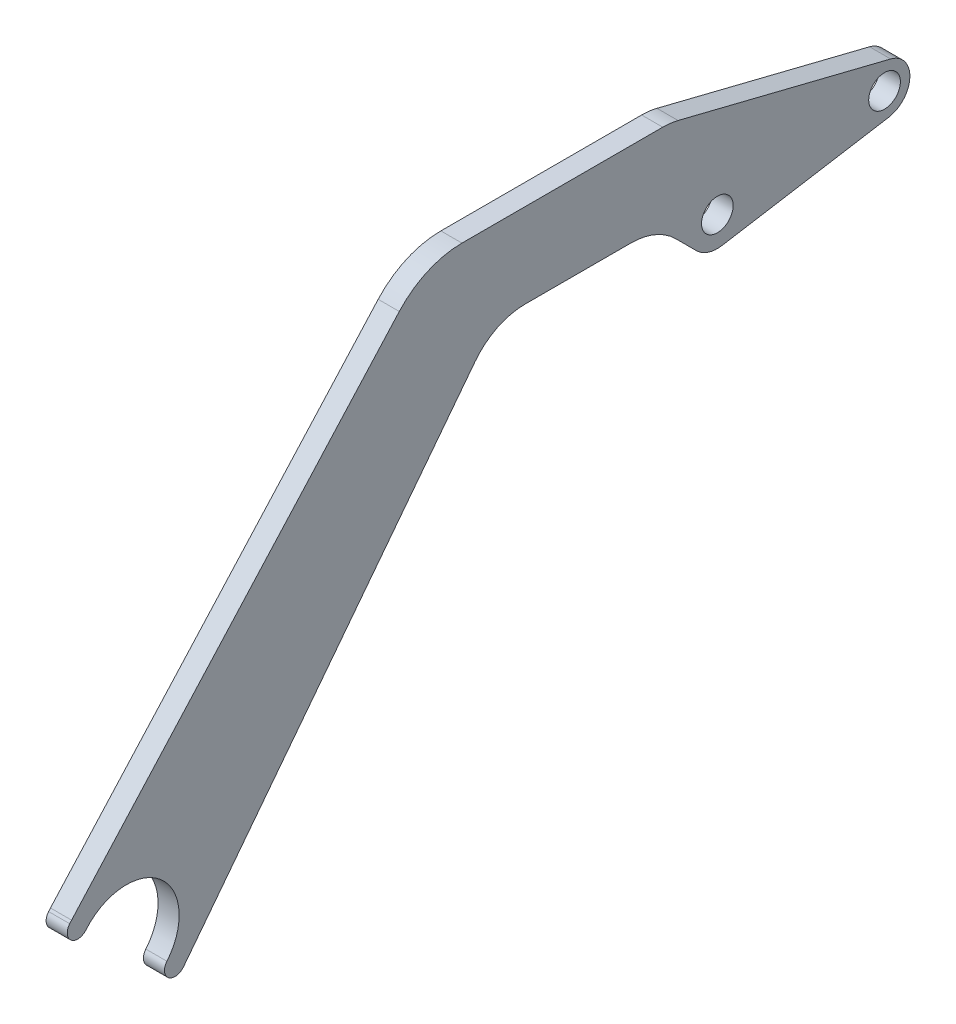
ISO-10303-21;
HEADER;
FILE_DESCRIPTION(('STEP AP214'),'2;1');
FILE_NAME('part.step','',(''),(''),'','','');
FILE_SCHEMA(('AUTOMOTIVE_DESIGN { 1 0 10303 214 1 1 1 1 }'));
ENDSEC;
DATA;
#1=APPLICATION_CONTEXT('core data for automotive mechanical design processes');
#2=APPLICATION_PROTOCOL_DEFINITION('international standard','automotive_design',2000,#1);
#3=PRODUCT_CONTEXT('',#1,'mechanical');
#4=PRODUCT('Part','Part','',(#3));
#5=PRODUCT_RELATED_PRODUCT_CATEGORY('part','',(#4));
#6=PRODUCT_DEFINITION_FORMATION('','',#4);
#7=PRODUCT_DEFINITION_CONTEXT('part definition',#1,'design');
#8=PRODUCT_DEFINITION('design','',#6,#7);
#9=PRODUCT_DEFINITION_SHAPE('','',#8);
#10=(LENGTH_UNIT() NAMED_UNIT(*) SI_UNIT(.MILLI.,.METRE.));
#11=(NAMED_UNIT(*) PLANE_ANGLE_UNIT() SI_UNIT($,.RADIAN.));
#12=(NAMED_UNIT(*) SI_UNIT($,.STERADIAN.) SOLID_ANGLE_UNIT());
#13=UNCERTAINTY_MEASURE_WITH_UNIT(LENGTH_MEASURE(1.E-05),#10,'distance_accuracy_value','');
#14=(GEOMETRIC_REPRESENTATION_CONTEXT(3) GLOBAL_UNCERTAINTY_ASSIGNED_CONTEXT((#13)) GLOBAL_UNIT_ASSIGNED_CONTEXT((#10,
#11,#12)) REPRESENTATION_CONTEXT('',''));
#15=CARTESIAN_POINT('',(0.,0.,0.));
#16=DIRECTION('',(0.,0.,1.));
#17=DIRECTION('',(1.,0.,0.));
#18=AXIS2_PLACEMENT_3D('',#15,#16,#17);
#19=CARTESIAN_POINT('',(6.35,0.,0.));
#20=DIRECTION('',(1.,0.,0.));
#21=DIRECTION('',(0.,0.,-1.));
#22=AXIS2_PLACEMENT_3D('',#19,#20,#21);
#23=PLANE('',#22);
#24=CARTESIAN_POINT('',(6.35,0.,0.));
#25=DIRECTION('',(1.,0.,0.));
#26=DIRECTION('',(0.,0.,-1.));
#27=AXIS2_PLACEMENT_3D('',#24,#25,#26);
#28=CIRCLE('',#27,4.7625);
#29=CARTESIAN_POINT('',(6.35,0.,-4.7625));
#30=VERTEX_POINT('',#29);
#31=EDGE_CURVE('E194',#30,#30,#28,.T.);
#32=ORIENTED_EDGE('',*,*,#31,.F.);
#33=EDGE_LOOP('',(#32));
#34=FACE_BOUND('',#33,.T.);
#35=CARTESIAN_POINT('',(6.35,0.,0.));
#36=DIRECTION('',(1.,0.,0.));
#37=DIRECTION('',(0.,0.,-1.));
#38=AXIS2_PLACEMENT_3D('',#35,#36,#37);
#39=CIRCLE('',#38,8.89);
#40=CARTESIAN_POINT('',(6.35,-6.28617928474841,6.28617928474841));
#41=VERTEX_POINT('',#40);
#42=CARTESIAN_POINT('',(6.35,-8.76980039095375,-1.45694924511027));
#43=VERTEX_POINT('',#42);
#44=EDGE_CURVE('E225',#41,#43,#39,.T.);
#45=ORIENTED_EDGE('',*,*,#44,.T.);
#46=DIRECTION('',(0.,0.163886304286869,-0.986479234078038));
#47=VECTOR('',#46,1.);
#48=CARTESIAN_POINT('',(6.35,-8.76980039095375,-1.45694924511027));
#49=LINE('',#48,#47);
#50=CARTESIAN_POINT('',(6.35,-0.446978234903299,-51.5544315307377));
#51=VERTEX_POINT('',#50);
#52=EDGE_CURVE('E123',#43,#51,#49,.T.);
#53=ORIENTED_EDGE('',*,*,#52,.T.);
#54=CARTESIAN_POINT('',(6.35,7.06999352877135,-50.3056178920718));
#55=DIRECTION('',(1.,0.,0.));
#56=DIRECTION('',(0.,0.,-1.));
#57=AXIS2_PLACEMENT_3D('',#54,#55,#56);
#58=CIRCLE('',#57,7.62);
#59=CARTESIAN_POINT('',(6.35,14.4636469629944,-52.1490627365412));
#60=VERTEX_POINT('',#59);
#61=EDGE_CURVE('E270',#51,#60,#58,.T.);
#62=ORIENTED_EDGE('',*,*,#61,.T.);
#63=DIRECTION('',(0.,0.241921895599661,0.970295726275998));
#64=VECTOR('',#63,1.);
#65=CARTESIAN_POINT('',(6.35,14.4636469629944,-52.1490627365412));
#66=LINE('',#65,#64);
#67=CARTESIAN_POINT('',(6.35,30.4137494039576,11.8233040216193));
#68=VERTEX_POINT('',#67);
#69=EDGE_CURVE('E289',#60,#68,#66,.T.);
#70=ORIENTED_EDGE('',*,*,#69,.T.);
#71=CARTESIAN_POINT('',(6.35,11.9296158183998,16.4319161327928));
#72=DIRECTION('',(1.,0.,0.));
#73=DIRECTION('',(0.,0.,-1.));
#74=AXIS2_PLACEMENT_3D('',#71,#72,#73);
#75=CIRCLE('',#74,19.05);
#76=CARTESIAN_POINT('',(6.35,30.9796158183998,16.4319161327928));
#77=VERTEX_POINT('',#76);
#78=EDGE_CURVE('E286',#68,#77,#75,.T.);
#79=ORIENTED_EDGE('',*,*,#78,.T.);
#80=DIRECTION('',(0.,0.,1.));
#81=VECTOR('',#80,1.);
#82=CARTESIAN_POINT('',(6.35,30.9796158183998,76.8427427511005));
#83=LINE('',#82,#81);
#84=CARTESIAN_POINT('',(6.35,30.9796158183998,76.8427427511005));
#85=VERTEX_POINT('',#84);
#86=EDGE_CURVE('E288',#77,#85,#83,.T.);
#87=ORIENTED_EDGE('',*,*,#86,.T.);
#88=CARTESIAN_POINT('',(6.35,5.57961581839983,76.8427427511005));
#89=DIRECTION('',(1.,0.,0.));
#90=DIRECTION('',(0.,0.,1.));
#91=AXIS2_PLACEMENT_3D('',#88,#89,#90);
#92=CIRCLE('',#91,25.4);
#93=CARTESIAN_POINT('',(6.35,22.5926706098456,95.7031766449235));
#94=VERTEX_POINT('',#93);
#95=EDGE_CURVE('E291',#85,#94,#92,.T.);
#96=ORIENTED_EDGE('',*,*,#95,.T.);
#97=DIRECTION('',(0.,-0.742536767473343,0.669805306749833));
#98=VECTOR('',#97,1.);
#99=CARTESIAN_POINT('',(6.35,22.5926706098456,95.7031766449235));
#100=LINE('',#99,#98);
#101=CARTESIAN_POINT('',(6.35,-86.7135770574849,194.302879657095));
#102=VERTEX_POINT('',#101);
#103=EDGE_CURVE('E297',#94,#102,#100,.T.);
#104=ORIENTED_EDGE('',*,*,#103,.T.);
#105=CARTESIAN_POINT('',(6.35,-101.6,177.8));
#106=DIRECTION('',(1.,0.,0.));
#107=DIRECTION('',(0.,0.,-1.));
#108=AXIS2_PLACEMENT_3D('',#105,#106,#107);
#109=CIRCLE('',#108,22.225);
#110=CARTESIAN_POINT('',(6.35,-87.36380166331,194.866964636936));
#111=VERTEX_POINT('',#110);
#112=EDGE_CURVE('E299',#102,#111,#109,.T.);
#113=ORIENTED_EDGE('',*,*,#112,.T.);
#114=CARTESIAN_POINT('',(6.35,-89.3975442828372,192.428826831659));
#115=DIRECTION('',(1.,0.,0.));
#116=DIRECTION('',(0.,0.,-1.));
#117=AXIS2_PLACEMENT_3D('',#114,#115,#116);
#118=CIRCLE('',#117,3.17500000000001);
#119=CARTESIAN_POINT('',(6.35,-91.4312869023643,189.990689026383));
#120=VERTEX_POINT('',#119);
#121=EDGE_CURVE('E301',#111,#120,#118,.T.);
#122=ORIENTED_EDGE('',*,*,#121,.T.);
#123=CARTESIAN_POINT('',(6.35,-101.6,177.8));
#124=DIRECTION('',(-1.,0.,0.));
#125=DIRECTION('',(0.,0.,-1.));
#126=AXIS2_PLACEMENT_3D('',#123,#124,#125);
#127=CIRCLE('',#126,15.875);
#128=CARTESIAN_POINT('',(6.35,-111.768713097636,165.609310973617));
#129=VERTEX_POINT('',#128);
#130=EDGE_CURVE('E303',#120,#129,#127,.T.);
#131=ORIENTED_EDGE('',*,*,#130,.T.);
#132=CARTESIAN_POINT('',(6.35,-113.802455717163,163.17117316834));
#133=DIRECTION('',(1.,0.,0.));
#134=DIRECTION('',(0.,0.,-1.));
#135=AXIS2_PLACEMENT_3D('',#132,#133,#134);
#136=CIRCLE('',#135,3.17500000000001);
#137=CARTESIAN_POINT('',(6.35,-115.83619833669,160.733035363064));
#138=VERTEX_POINT('',#137);
#139=EDGE_CURVE('E305',#129,#138,#136,.T.);
#140=ORIENTED_EDGE('',*,*,#139,.T.);
#141=CARTESIAN_POINT('',(6.35,-101.6,177.8));
#142=DIRECTION('',(1.,0.,0.));
#143=DIRECTION('',(0.,0.,-1.));
#144=AXIS2_PLACEMENT_3D('',#141,#142,#143);
#145=CIRCLE('',#144,22.225);
#146=CARTESIAN_POINT('',(6.35,-115.164617762745,160.194552832983));
#147=VERTEX_POINT('',#146);
#148=EDGE_CURVE('E307',#138,#147,#145,.T.);
#149=ORIENTED_EDGE('',*,*,#148,.T.);
#150=DIRECTION('',(0.,0.79214610425273,-0.610331507885037));
#151=VECTOR('',#150,1.);
#152=CARTESIAN_POINT('',(6.35,-1.84356895639377,72.883126037115));
#153=LINE('',#152,#151);
#154=CARTESIAN_POINT('',(6.35,-1.84356895639377,72.883126037115));
#155=VERTEX_POINT('',#154);
#156=EDGE_CURVE('E309',#147,#155,#153,.T.);
#157=ORIENTED_EDGE('',*,*,#156,.T.);
#158=CARTESIAN_POINT('',(6.35,-13.4703841816037,57.7927427511005));
#159=DIRECTION('',(-1.,0.,0.));
#160=DIRECTION('',(0.,0.,-1.));
#161=AXIS2_PLACEMENT_3D('',#158,#159,#160);
#162=CIRCLE('',#161,19.05);
#163=CARTESIAN_POINT('',(6.35,5.57961581839627,57.7927427511005));
#164=VERTEX_POINT('',#163);
#165=EDGE_CURVE('E172',#155,#164,#162,.T.);
#166=ORIENTED_EDGE('',*,*,#165,.T.);
#167=DIRECTION('',(0.,0.,-1.));
#168=VECTOR('',#167,1.);
#169=CARTESIAN_POINT('',(6.35,5.57961581839627,26.0427427511006));
#170=LINE('',#169,#168);
#171=CARTESIAN_POINT('',(6.35,5.57961581839627,26.0427427511006));
#172=VERTEX_POINT('',#171);
#173=EDGE_CURVE('E166',#164,#172,#170,.T.);
#174=ORIENTED_EDGE('',*,*,#173,.T.);
#175=CARTESIAN_POINT('',(6.35,-13.4703841816037,26.0427427511006));
#176=DIRECTION('',(-1.,0.,0.));
#177=DIRECTION('',(0.,0.,-1.));
#178=AXIS2_PLACEMENT_3D('',#175,#176,#177);
#179=CIRCLE('',#178,19.05);
#180=CARTESIAN_POINT('',(6.35,0.,12.5723585694968));
#181=VERTEX_POINT('',#180);
#182=EDGE_CURVE('E170',#172,#181,#179,.T.);
#183=ORIENTED_EDGE('',*,*,#182,.T.);
#184=DIRECTION('',(0.,-0.707106781186548,-0.707106781186547));
#185=VECTOR('',#184,1.);
#186=CARTESIAN_POINT('',(6.35,0.,12.5723585694968));
#187=LINE('',#186,#185);
#188=EDGE_CURVE('E50',#181,#41,#187,.T.);
#189=ORIENTED_EDGE('',*,*,#188,.T.);
#190=EDGE_LOOP('',(#45,#53,#62,#70,#79,#87,#96,#104,#113,#122,#131,#140,#149,#157,#166,#174,
#183,#189));
#191=FACE_BOUND('',#190,.T.);
#192=CARTESIAN_POINT('',(6.35,7.06999352877135,-50.3056178920718));
#193=DIRECTION('',(1.,0.,0.));
#194=DIRECTION('',(0.,0.,-1.));
#195=AXIS2_PLACEMENT_3D('',#192,#193,#194);
#196=CIRCLE('',#195,4.7625);
#197=CARTESIAN_POINT('',(6.35,7.06999352877135,-55.0681178920718));
#198=VERTEX_POINT('',#197);
#199=EDGE_CURVE('E351',#198,#198,#196,.T.);
#200=ORIENTED_EDGE('',*,*,#199,.F.);
#201=EDGE_LOOP('',(#200));
#202=FACE_BOUND('',#201,.T.);
#203=ADVANCED_FACE('F33',(#34,#191,#202),#23,.T.);
#204=CARTESIAN_POINT('',(0.,0.,0.));
#205=DIRECTION('',(1.,0.,0.));
#206=DIRECTION('',(0.,0.,-1.));
#207=AXIS2_PLACEMENT_3D('',#204,#205,#206);
#208=PLANE('',#207);
#209=CARTESIAN_POINT('',(0.,0.,0.));
#210=DIRECTION('',(1.,0.,0.));
#211=DIRECTION('',(0.,0.,-1.));
#212=AXIS2_PLACEMENT_3D('',#209,#210,#211);
#213=CIRCLE('',#212,8.89);
#214=CARTESIAN_POINT('',(0.,-6.28617928474841,6.28617928474841));
#215=VERTEX_POINT('',#214);
#216=CARTESIAN_POINT('',(0.,-8.76980039095375,-1.45694924511027));
#217=VERTEX_POINT('',#216);
#218=EDGE_CURVE('E190',#215,#217,#213,.T.);
#219=ORIENTED_EDGE('',*,*,#218,.F.);
#220=DIRECTION('',(0.,-0.707106781186548,-0.707106781186547));
#221=VECTOR('',#220,1.);
#222=CARTESIAN_POINT('',(0.,0.,12.5723585694968));
#223=LINE('',#222,#221);
#224=CARTESIAN_POINT('',(0.,0.,12.5723585694968));
#225=VERTEX_POINT('',#224);
#226=EDGE_CURVE('E115',#225,#215,#223,.T.);
#227=ORIENTED_EDGE('',*,*,#226,.F.);
#228=CARTESIAN_POINT('',(0.,-13.4703841816037,26.0427427511006));
#229=DIRECTION('',(-1.,0.,0.));
#230=DIRECTION('',(0.,0.,-1.));
#231=AXIS2_PLACEMENT_3D('',#228,#229,#230);
#232=CIRCLE('',#231,19.05);
#233=CARTESIAN_POINT('',(0.,5.57961581839627,26.0427427511006));
#234=VERTEX_POINT('',#233);
#235=EDGE_CURVE('E109',#234,#225,#232,.T.);
#236=ORIENTED_EDGE('',*,*,#235,.F.);
#237=DIRECTION('',(0.,0.,-1.));
#238=VECTOR('',#237,1.);
#239=CARTESIAN_POINT('',(0.,5.57961581839627,26.0427427511006));
#240=LINE('',#239,#238);
#241=CARTESIAN_POINT('',(0.,5.57961581839627,57.7927427511005));
#242=VERTEX_POINT('',#241);
#243=EDGE_CURVE('E180',#242,#234,#240,.T.);
#244=ORIENTED_EDGE('',*,*,#243,.F.);
#245=CARTESIAN_POINT('',(0.,-13.4703841816037,57.7927427511005));
#246=DIRECTION('',(-1.,0.,0.));
#247=DIRECTION('',(0.,0.,-1.));
#248=AXIS2_PLACEMENT_3D('',#245,#246,#247);
#249=CIRCLE('',#248,19.05);
#250=CARTESIAN_POINT('',(0.,-1.84356895639377,72.883126037115));
#251=VERTEX_POINT('',#250);
#252=EDGE_CURVE('E220',#251,#242,#249,.T.);
#253=ORIENTED_EDGE('',*,*,#252,.F.);
#254=DIRECTION('',(0.,0.79214610425273,-0.610331507885037));
#255=VECTOR('',#254,1.);
#256=CARTESIAN_POINT('',(0.,-1.84356895639377,72.883126037115));
#257=LINE('',#256,#255);
#258=CARTESIAN_POINT('',(0.,-115.164617762745,160.194552832983));
#259=VERTEX_POINT('',#258);
#260=EDGE_CURVE('E218',#259,#251,#257,.T.);
#261=ORIENTED_EDGE('',*,*,#260,.F.);
#262=CARTESIAN_POINT('',(0.,-101.6,177.8));
#263=DIRECTION('',(1.,0.,0.));
#264=DIRECTION('',(0.,0.,-1.));
#265=AXIS2_PLACEMENT_3D('',#262,#263,#264);
#266=CIRCLE('',#265,22.225);
#267=CARTESIAN_POINT('',(0.,-115.83619833669,160.733035363064));
#268=VERTEX_POINT('',#267);
#269=EDGE_CURVE('E216',#268,#259,#266,.T.);
#270=ORIENTED_EDGE('',*,*,#269,.F.);
#271=CARTESIAN_POINT('',(0.,-113.802455717163,163.17117316834));
#272=DIRECTION('',(1.,0.,0.));
#273=DIRECTION('',(0.,0.,-1.));
#274=AXIS2_PLACEMENT_3D('',#271,#272,#273);
#275=CIRCLE('',#274,3.17500000000001);
#276=CARTESIAN_POINT('',(0.,-111.768713097636,165.609310973617));
#277=VERTEX_POINT('',#276);
#278=EDGE_CURVE('E214',#277,#268,#275,.T.);
#279=ORIENTED_EDGE('',*,*,#278,.F.);
#280=CARTESIAN_POINT('',(0.,-101.6,177.8));
#281=DIRECTION('',(-1.,0.,0.));
#282=DIRECTION('',(0.,0.,-1.));
#283=AXIS2_PLACEMENT_3D('',#280,#281,#282);
#284=CIRCLE('',#283,15.875);
#285=CARTESIAN_POINT('',(0.,-91.4312869023643,189.990689026383));
#286=VERTEX_POINT('',#285);
#287=EDGE_CURVE('E212',#286,#277,#284,.T.);
#288=ORIENTED_EDGE('',*,*,#287,.F.);
#289=CARTESIAN_POINT('',(0.,-89.3975442828372,192.428826831659));
#290=DIRECTION('',(1.,0.,0.));
#291=DIRECTION('',(0.,0.,-1.));
#292=AXIS2_PLACEMENT_3D('',#289,#290,#291);
#293=CIRCLE('',#292,3.17500000000001);
#294=CARTESIAN_POINT('',(0.,-87.36380166331,194.866964636936));
#295=VERTEX_POINT('',#294);
#296=EDGE_CURVE('E210',#295,#286,#293,.T.);
#297=ORIENTED_EDGE('',*,*,#296,.F.);
#298=CARTESIAN_POINT('',(0.,-101.6,177.8));
#299=DIRECTION('',(1.,0.,0.));
#300=DIRECTION('',(0.,0.,-1.));
#301=AXIS2_PLACEMENT_3D('',#298,#299,#300);
#302=CIRCLE('',#301,22.225);
#303=CARTESIAN_POINT('',(0.,-86.7135770574849,194.302879657095));
#304=VERTEX_POINT('',#303);
#305=EDGE_CURVE('E208',#304,#295,#302,.T.);
#306=ORIENTED_EDGE('',*,*,#305,.F.);
#307=DIRECTION('',(0.,-0.742536767473343,0.669805306749833));
#308=VECTOR('',#307,1.);
#309=CARTESIAN_POINT('',(0.,22.5926706098456,95.7031766449235));
#310=LINE('',#309,#308);
#311=CARTESIAN_POINT('',(0.,22.5926706098456,95.7031766449235));
#312=VERTEX_POINT('',#311);
#313=EDGE_CURVE('E206',#312,#304,#310,.T.);
#314=ORIENTED_EDGE('',*,*,#313,.F.);
#315=CARTESIAN_POINT('',(0.,5.57961581839983,76.8427427511005));
#316=DIRECTION('',(1.,0.,0.));
#317=DIRECTION('',(0.,0.,1.));
#318=AXIS2_PLACEMENT_3D('',#315,#316,#317);
#319=CIRCLE('',#318,25.4);
#320=CARTESIAN_POINT('',(0.,30.9796158183998,76.8427427511005));
#321=VERTEX_POINT('',#320);
#322=EDGE_CURVE('E204',#321,#312,#319,.T.);
#323=ORIENTED_EDGE('',*,*,#322,.F.);
#324=DIRECTION('',(0.,0.,1.));
#325=VECTOR('',#324,1.);
#326=CARTESIAN_POINT('',(0.,30.9796158183998,76.8427427511005));
#327=LINE('',#326,#325);
#328=CARTESIAN_POINT('',(0.,30.9796158183998,16.4319161327928));
#329=VERTEX_POINT('',#328);
#330=EDGE_CURVE('E202',#329,#321,#327,.T.);
#331=ORIENTED_EDGE('',*,*,#330,.F.);
#332=CARTESIAN_POINT('',(0.,11.9296158183998,16.4319161327928));
#333=DIRECTION('',(1.,0.,0.));
#334=DIRECTION('',(0.,0.,-1.));
#335=AXIS2_PLACEMENT_3D('',#332,#333,#334);
#336=CIRCLE('',#335,19.05);
#337=CARTESIAN_POINT('',(0.,30.4137494039576,11.8233040216193));
#338=VERTEX_POINT('',#337);
#339=EDGE_CURVE('E200',#338,#329,#336,.T.);
#340=ORIENTED_EDGE('',*,*,#339,.F.);
#341=DIRECTION('',(0.,0.241921895599661,0.970295726275998));
#342=VECTOR('',#341,1.);
#343=CARTESIAN_POINT('',(0.,14.4636469629944,-52.1490627365412));
#344=LINE('',#343,#342);
#345=CARTESIAN_POINT('',(0.,14.4636469629944,-52.1490627365412));
#346=VERTEX_POINT('',#345);
#347=EDGE_CURVE('E198',#346,#338,#344,.T.);
#348=ORIENTED_EDGE('',*,*,#347,.F.);
#349=CARTESIAN_POINT('',(0.,7.06999352877135,-50.3056178920718));
#350=DIRECTION('',(1.,0.,0.));
#351=DIRECTION('',(0.,0.,-1.));
#352=AXIS2_PLACEMENT_3D('',#349,#350,#351);
#353=CIRCLE('',#352,7.62);
#354=CARTESIAN_POINT('',(0.,-0.446978234903299,-51.5544315307377));
#355=VERTEX_POINT('',#354);
#356=EDGE_CURVE('E196',#355,#346,#353,.T.);
#357=ORIENTED_EDGE('',*,*,#356,.F.);
#358=DIRECTION('',(0.,0.163886304286869,-0.986479234078038));
#359=VECTOR('',#358,1.);
#360=CARTESIAN_POINT('',(0.,-8.76980039095375,-1.45694924511027));
#361=LINE('',#360,#359);
#362=EDGE_CURVE('E193',#217,#355,#361,.T.);
#363=ORIENTED_EDGE('',*,*,#362,.F.);
#364=EDGE_LOOP('',(#219,#227,#236,#244,#253,#261,#270,#279,#288,#297,#306,#314,#323,#331,#340,
#348,#357,#363));
#365=FACE_BOUND('',#364,.T.);
#366=CARTESIAN_POINT('',(0.,0.,0.));
#367=DIRECTION('',(1.,0.,0.));
#368=DIRECTION('',(0.,0.,-1.));
#369=AXIS2_PLACEMENT_3D('',#366,#367,#368);
#370=CIRCLE('',#369,4.7625);
#371=CARTESIAN_POINT('',(0.,0.,-4.7625));
#372=VERTEX_POINT('',#371);
#373=EDGE_CURVE('E357',#372,#372,#370,.T.);
#374=ORIENTED_EDGE('',*,*,#373,.T.);
#375=EDGE_LOOP('',(#374));
#376=FACE_BOUND('',#375,.T.);
#377=CARTESIAN_POINT('',(0.,7.06999352877135,-50.3056178920718));
#378=DIRECTION('',(1.,0.,0.));
#379=DIRECTION('',(0.,0.,-1.));
#380=AXIS2_PLACEMENT_3D('',#377,#378,#379);
#381=CIRCLE('',#380,4.7625);
#382=CARTESIAN_POINT('',(0.,7.06999352877135,-55.0681178920718));
#383=VERTEX_POINT('',#382);
#384=EDGE_CURVE('E354',#383,#383,#381,.T.);
#385=ORIENTED_EDGE('',*,*,#384,.T.);
#386=EDGE_LOOP('',(#385));
#387=FACE_BOUND('',#386,.T.);
#388=ADVANCED_FACE('F274',(#365,#376,#387),#208,.F.);
#389=CARTESIAN_POINT('',(6.35,0.,0.));
#390=DIRECTION('',(-1.,0.,0.));
#391=DIRECTION('',(0.,0.,1.));
#392=AXIS2_PLACEMENT_3D('',#389,#390,#391);
#393=CYLINDRICAL_SURFACE('',#392,8.89);
#394=ORIENTED_EDGE('',*,*,#218,.T.);
#395=DIRECTION('',(-1.,0.,0.));
#396=VECTOR('',#395,1.);
#397=CARTESIAN_POINT('',(6.35,-8.76980039095375,-1.45694924511027));
#398=LINE('',#397,#396);
#399=EDGE_CURVE('E11',#43,#217,#398,.T.);
#400=ORIENTED_EDGE('',*,*,#399,.F.);
#401=ORIENTED_EDGE('',*,*,#44,.F.);
#402=DIRECTION('',(-1.,0.,0.));
#403=VECTOR('',#402,1.);
#404=CARTESIAN_POINT('',(6.35,-6.28617928474841,6.28617928474841));
#405=LINE('',#404,#403);
#406=EDGE_CURVE('E186',#41,#215,#405,.T.);
#407=ORIENTED_EDGE('',*,*,#406,.T.);
#408=EDGE_LOOP('',(#394,#400,#401,#407));
#409=FACE_BOUND('',#408,.T.);
#410=ADVANCED_FACE('F35',(#409),#393,.T.);
#411=CARTESIAN_POINT('',(6.35,-8.76980039095375,-1.45694924511027));
#412=DIRECTION('',(0.,0.986479234078038,0.163886304286869));
#413=DIRECTION('',(0.,-0.163886304286869,0.986479234078038));
#414=AXIS2_PLACEMENT_3D('',#411,#412,#413);
#415=PLANE('',#414);
#416=ORIENTED_EDGE('',*,*,#362,.T.);
#417=DIRECTION('',(-1.,0.,0.));
#418=VECTOR('',#417,1.);
#419=CARTESIAN_POINT('',(6.35,-0.446978234903299,-51.5544315307377));
#420=LINE('',#419,#418);
#421=EDGE_CURVE('E42',#51,#355,#420,.T.);
#422=ORIENTED_EDGE('',*,*,#421,.F.);
#423=ORIENTED_EDGE('',*,*,#52,.F.);
#424=ORIENTED_EDGE('',*,*,#399,.T.);
#425=EDGE_LOOP('',(#416,#422,#423,#424));
#426=FACE_BOUND('',#425,.T.);
#427=ADVANCED_FACE('F510',(#426),#415,.F.);
#428=CARTESIAN_POINT('',(6.35,7.06999352877135,-50.3056178920718));
#429=DIRECTION('',(-1.,0.,0.));
#430=DIRECTION('',(0.,0.,1.));
#431=AXIS2_PLACEMENT_3D('',#428,#429,#430);
#432=CYLINDRICAL_SURFACE('',#431,7.62);
#433=ORIENTED_EDGE('',*,*,#356,.T.);
#434=DIRECTION('',(-1.,0.,0.));
#435=VECTOR('',#434,1.);
#436=CARTESIAN_POINT('',(6.35,14.4636469629944,-52.1490627365412));
#437=LINE('',#436,#435);
#438=EDGE_CURVE('E262',#60,#346,#437,.T.);
#439=ORIENTED_EDGE('',*,*,#438,.F.);
#440=ORIENTED_EDGE('',*,*,#61,.F.);
#441=ORIENTED_EDGE('',*,*,#421,.T.);
#442=EDGE_LOOP('',(#433,#439,#440,#441));
#443=FACE_BOUND('',#442,.T.);
#444=ADVANCED_FACE('F268',(#443),#432,.T.);
#445=CARTESIAN_POINT('',(6.35,14.4636469629944,-52.1490627365412));
#446=DIRECTION('',(0.,-0.970295726275998,0.241921895599661));
#447=DIRECTION('',(0.,-0.241921895599661,-0.970295726275998));
#448=AXIS2_PLACEMENT_3D('',#445,#446,#447);
#449=PLANE('',#448);
#450=ORIENTED_EDGE('',*,*,#347,.T.);
#451=DIRECTION('',(-1.,0.,0.));
#452=VECTOR('',#451,1.);
#453=CARTESIAN_POINT('',(6.35,30.4137494039576,11.8233040216193));
#454=LINE('',#453,#452);
#455=EDGE_CURVE('E259',#68,#338,#454,.T.);
#456=ORIENTED_EDGE('',*,*,#455,.F.);
#457=ORIENTED_EDGE('',*,*,#69,.F.);
#458=ORIENTED_EDGE('',*,*,#438,.T.);
#459=EDGE_LOOP('',(#450,#456,#457,#458));
#460=FACE_BOUND('',#459,.T.);
#461=ADVANCED_FACE('F280',(#460),#449,.F.);
#462=CARTESIAN_POINT('',(6.35,11.9296158183998,16.4319161327928));
#463=DIRECTION('',(-1.,0.,0.));
#464=DIRECTION('',(0.,0.,1.));
#465=AXIS2_PLACEMENT_3D('',#462,#463,#464);
#466=CYLINDRICAL_SURFACE('',#465,19.05);
#467=ORIENTED_EDGE('',*,*,#339,.T.);
#468=DIRECTION('',(-1.,0.,0.));
#469=VECTOR('',#468,1.);
#470=CARTESIAN_POINT('',(6.35,30.9796158183998,16.4319161327928));
#471=LINE('',#470,#469);
#472=EDGE_CURVE('E256',#77,#329,#471,.T.);
#473=ORIENTED_EDGE('',*,*,#472,.F.);
#474=ORIENTED_EDGE('',*,*,#78,.F.);
#475=ORIENTED_EDGE('',*,*,#455,.T.);
#476=EDGE_LOOP('',(#467,#473,#474,#475));
#477=FACE_BOUND('',#476,.T.);
#478=ADVANCED_FACE('F284',(#477),#466,.T.);
#479=CARTESIAN_POINT('',(6.35,30.9796158183998,76.8427427511005));
#480=DIRECTION('',(0.,-1.,0.));
#481=DIRECTION('',(0.,0.,-1.));
#482=AXIS2_PLACEMENT_3D('',#479,#480,#481);
#483=PLANE('',#482);
#484=ORIENTED_EDGE('',*,*,#330,.T.);
#485=DIRECTION('',(-1.,0.,0.));
#486=VECTOR('',#485,1.);
#487=CARTESIAN_POINT('',(6.35,30.9796158183998,76.8427427511005));
#488=LINE('',#487,#486);
#489=EDGE_CURVE('E253',#85,#321,#488,.T.);
#490=ORIENTED_EDGE('',*,*,#489,.F.);
#491=ORIENTED_EDGE('',*,*,#86,.F.);
#492=ORIENTED_EDGE('',*,*,#472,.T.);
#493=EDGE_LOOP('',(#484,#490,#491,#492));
#494=FACE_BOUND('',#493,.T.);
#495=ADVANCED_FACE('F475',(#494),#483,.F.);
#496=CARTESIAN_POINT('',(6.35,5.57961581839983,76.8427427511005));
#497=DIRECTION('',(-1.,0.,0.));
#498=DIRECTION('',(0.,0.,1.));
#499=AXIS2_PLACEMENT_3D('',#496,#497,#498);
#500=CYLINDRICAL_SURFACE('',#499,25.4);
#501=ORIENTED_EDGE('',*,*,#322,.T.);
#502=DIRECTION('',(-1.,0.,0.));
#503=VECTOR('',#502,1.);
#504=CARTESIAN_POINT('',(6.35,22.5926706098456,95.7031766449235));
#505=LINE('',#504,#503);
#506=EDGE_CURVE('E250',#94,#312,#505,.T.);
#507=ORIENTED_EDGE('',*,*,#506,.F.);
#508=ORIENTED_EDGE('',*,*,#95,.F.);
#509=ORIENTED_EDGE('',*,*,#489,.T.);
#510=EDGE_LOOP('',(#501,#507,#508,#509));
#511=FACE_BOUND('',#510,.T.);
#512=ADVANCED_FACE('F465',(#511),#500,.T.);
#513=CARTESIAN_POINT('',(6.35,22.5926706098456,95.7031766449235));
#514=DIRECTION('',(0.,-0.669805306749833,-0.742536767473343));
#515=DIRECTION('',(0.,0.742536767473343,-0.669805306749833));
#516=AXIS2_PLACEMENT_3D('',#513,#514,#515);
#517=PLANE('',#516);
#518=ORIENTED_EDGE('',*,*,#313,.T.);
#519=DIRECTION('',(-1.,0.,0.));
#520=VECTOR('',#519,1.);
#521=CARTESIAN_POINT('',(6.35,-86.7135770574849,194.302879657095));
#522=LINE('',#521,#520);
#523=EDGE_CURVE('E247',#102,#304,#522,.T.);
#524=ORIENTED_EDGE('',*,*,#523,.F.);
#525=ORIENTED_EDGE('',*,*,#103,.F.);
#526=ORIENTED_EDGE('',*,*,#506,.T.);
#527=EDGE_LOOP('',(#518,#524,#525,#526));
#528=FACE_BOUND('',#527,.T.);
#529=ADVANCED_FACE('F455',(#528),#517,.F.);
#530=CARTESIAN_POINT('',(6.35,-101.6,177.8));
#531=DIRECTION('',(-1.,0.,0.));
#532=DIRECTION('',(0.,0.,1.));
#533=AXIS2_PLACEMENT_3D('',#530,#531,#532);
#534=CYLINDRICAL_SURFACE('',#533,22.225);
#535=ORIENTED_EDGE('',*,*,#305,.T.);
#536=DIRECTION('',(-1.,0.,0.));
#537=VECTOR('',#536,1.);
#538=CARTESIAN_POINT('',(6.35,-87.36380166331,194.866964636936));
#539=LINE('',#538,#537);
#540=EDGE_CURVE('E244',#111,#295,#539,.T.);
#541=ORIENTED_EDGE('',*,*,#540,.F.);
#542=ORIENTED_EDGE('',*,*,#112,.F.);
#543=ORIENTED_EDGE('',*,*,#523,.T.);
#544=EDGE_LOOP('',(#535,#541,#542,#543));
#545=FACE_BOUND('',#544,.T.);
#546=ADVANCED_FACE('F445',(#545),#534,.T.);
#547=CARTESIAN_POINT('',(6.35,-89.3975442828372,192.428826831659));
#548=DIRECTION('',(-1.,0.,0.));
#549=DIRECTION('',(0.,0.,1.));
#550=AXIS2_PLACEMENT_3D('',#547,#548,#549);
#551=CYLINDRICAL_SURFACE('',#550,3.17500000000001);
#552=ORIENTED_EDGE('',*,*,#296,.T.);
#553=DIRECTION('',(-1.,0.,0.));
#554=VECTOR('',#553,1.);
#555=CARTESIAN_POINT('',(6.35,-91.4312869023643,189.990689026383));
#556=LINE('',#555,#554);
#557=EDGE_CURVE('E241',#120,#286,#556,.T.);
#558=ORIENTED_EDGE('',*,*,#557,.F.);
#559=ORIENTED_EDGE('',*,*,#121,.F.);
#560=ORIENTED_EDGE('',*,*,#540,.T.);
#561=EDGE_LOOP('',(#552,#558,#559,#560));
#562=FACE_BOUND('',#561,.T.);
#563=ADVANCED_FACE('F435',(#562),#551,.T.);
#564=CARTESIAN_POINT('',(6.35,-101.6,177.8));
#565=DIRECTION('',(-1.,0.,0.));
#566=DIRECTION('',(0.,0.,1.));
#567=AXIS2_PLACEMENT_3D('',#564,#565,#566);
#568=CYLINDRICAL_SURFACE('',#567,15.875);
#569=ORIENTED_EDGE('',*,*,#287,.T.);
#570=DIRECTION('',(-1.,0.,0.));
#571=VECTOR('',#570,1.);
#572=CARTESIAN_POINT('',(6.35,-111.768713097636,165.609310973617));
#573=LINE('',#572,#571);
#574=EDGE_CURVE('E238',#129,#277,#573,.T.);
#575=ORIENTED_EDGE('',*,*,#574,.F.);
#576=ORIENTED_EDGE('',*,*,#130,.F.);
#577=ORIENTED_EDGE('',*,*,#557,.T.);
#578=EDGE_LOOP('',(#569,#575,#576,#577));
#579=FACE_BOUND('',#578,.T.);
#580=ADVANCED_FACE('F425',(#579),#568,.F.);
#581=CARTESIAN_POINT('',(6.35,-113.802455717163,163.17117316834));
#582=DIRECTION('',(-1.,0.,0.));
#583=DIRECTION('',(0.,0.,1.));
#584=AXIS2_PLACEMENT_3D('',#581,#582,#583);
#585=CYLINDRICAL_SURFACE('',#584,3.17500000000001);
#586=ORIENTED_EDGE('',*,*,#278,.T.);
#587=DIRECTION('',(-1.,0.,0.));
#588=VECTOR('',#587,1.);
#589=CARTESIAN_POINT('',(6.35,-115.83619833669,160.733035363064));
#590=LINE('',#589,#588);
#591=EDGE_CURVE('E235',#138,#268,#590,.T.);
#592=ORIENTED_EDGE('',*,*,#591,.F.);
#593=ORIENTED_EDGE('',*,*,#139,.F.);
#594=ORIENTED_EDGE('',*,*,#574,.T.);
#595=EDGE_LOOP('',(#586,#592,#593,#594));
#596=FACE_BOUND('',#595,.T.);
#597=ADVANCED_FACE('F415',(#596),#585,.T.);
#598=CARTESIAN_POINT('',(6.35,-101.6,177.8));
#599=DIRECTION('',(-1.,0.,0.));
#600=DIRECTION('',(0.,0.,1.));
#601=AXIS2_PLACEMENT_3D('',#598,#599,#600);
#602=CYLINDRICAL_SURFACE('',#601,22.225);
#603=ORIENTED_EDGE('',*,*,#269,.T.);
#604=DIRECTION('',(-1.,0.,0.));
#605=VECTOR('',#604,1.);
#606=CARTESIAN_POINT('',(6.35,-115.164617762745,160.194552832983));
#607=LINE('',#606,#605);
#608=EDGE_CURVE('E232',#147,#259,#607,.T.);
#609=ORIENTED_EDGE('',*,*,#608,.F.);
#610=ORIENTED_EDGE('',*,*,#148,.F.);
#611=ORIENTED_EDGE('',*,*,#591,.T.);
#612=EDGE_LOOP('',(#603,#609,#610,#611));
#613=FACE_BOUND('',#612,.T.);
#614=ADVANCED_FACE('F406',(#613),#602,.T.);
#615=CARTESIAN_POINT('',(6.35,-1.84356895639377,72.883126037115));
#616=DIRECTION('',(0.,0.610331507885037,0.79214610425273));
#617=DIRECTION('',(0.,-0.79214610425273,0.610331507885037));
#618=AXIS2_PLACEMENT_3D('',#615,#616,#617);
#619=PLANE('',#618);
#620=ORIENTED_EDGE('',*,*,#260,.T.);
#621=DIRECTION('',(-1.,0.,0.));
#622=VECTOR('',#621,1.);
#623=CARTESIAN_POINT('',(6.35,-1.84356895639377,72.883126037115));
#624=LINE('',#623,#622);
#625=EDGE_CURVE('E229',#155,#251,#624,.T.);
#626=ORIENTED_EDGE('',*,*,#625,.F.);
#627=ORIENTED_EDGE('',*,*,#156,.F.);
#628=ORIENTED_EDGE('',*,*,#608,.T.);
#629=EDGE_LOOP('',(#620,#626,#627,#628));
#630=FACE_BOUND('',#629,.T.);
#631=ADVANCED_FACE('F315',(#630),#619,.F.);
#632=CARTESIAN_POINT('',(6.35,-13.4703841816037,57.7927427511005));
#633=DIRECTION('',(-1.,0.,0.));
#634=DIRECTION('',(0.,0.,1.));
#635=AXIS2_PLACEMENT_3D('',#632,#633,#634);
#636=CYLINDRICAL_SURFACE('',#635,19.05);
#637=ORIENTED_EDGE('',*,*,#252,.T.);
#638=DIRECTION('',(-1.,0.,0.));
#639=VECTOR('',#638,1.);
#640=CARTESIAN_POINT('',(6.35,5.57961581839627,57.7927427511005));
#641=LINE('',#640,#639);
#642=EDGE_CURVE('E181',#164,#242,#641,.T.);
#643=ORIENTED_EDGE('',*,*,#642,.F.);
#644=ORIENTED_EDGE('',*,*,#165,.F.);
#645=ORIENTED_EDGE('',*,*,#625,.T.);
#646=EDGE_LOOP('',(#637,#643,#644,#645));
#647=FACE_BOUND('',#646,.T.);
#648=ADVANCED_FACE('F319',(#647),#636,.F.);
#649=CARTESIAN_POINT('',(6.35,5.57961581839627,26.0427427511006));
#650=DIRECTION('',(0.,1.,0.));
#651=DIRECTION('',(0.,0.,1.));
#652=AXIS2_PLACEMENT_3D('',#649,#650,#651);
#653=PLANE('',#652);
#654=ORIENTED_EDGE('',*,*,#243,.T.);
#655=DIRECTION('',(-1.,0.,0.));
#656=VECTOR('',#655,1.);
#657=CARTESIAN_POINT('',(6.35,5.57961581839627,26.0427427511006));
#658=LINE('',#657,#656);
#659=EDGE_CURVE('E177',#172,#234,#658,.T.);
#660=ORIENTED_EDGE('',*,*,#659,.F.);
#661=ORIENTED_EDGE('',*,*,#173,.F.);
#662=ORIENTED_EDGE('',*,*,#642,.T.);
#663=EDGE_LOOP('',(#654,#660,#661,#662));
#664=FACE_BOUND('',#663,.T.);
#665=ADVANCED_FACE('F178',(#664),#653,.F.);
#666=CARTESIAN_POINT('',(6.35,-13.4703841816037,26.0427427511006));
#667=DIRECTION('',(-1.,0.,0.));
#668=DIRECTION('',(0.,0.,1.));
#669=AXIS2_PLACEMENT_3D('',#666,#667,#668);
#670=CYLINDRICAL_SURFACE('',#669,19.05);
#671=ORIENTED_EDGE('',*,*,#235,.T.);
#672=DIRECTION('',(-1.,0.,0.));
#673=VECTOR('',#672,1.);
#674=CARTESIAN_POINT('',(6.35,0.,12.5723585694968));
#675=LINE('',#674,#673);
#676=EDGE_CURVE('E182',#181,#225,#675,.T.);
#677=ORIENTED_EDGE('',*,*,#676,.F.);
#678=ORIENTED_EDGE('',*,*,#182,.F.);
#679=ORIENTED_EDGE('',*,*,#659,.T.);
#680=EDGE_LOOP('',(#671,#677,#678,#679));
#681=FACE_BOUND('',#680,.T.);
#682=ADVANCED_FACE('F184',(#681),#670,.F.);
#683=CARTESIAN_POINT('',(6.35,0.,12.5723585694968));
#684=DIRECTION('',(0.,0.707106781186547,-0.707106781186548));
#685=DIRECTION('',(0.,0.707106781186548,0.707106781186547));
#686=AXIS2_PLACEMENT_3D('',#683,#684,#685);
#687=PLANE('',#686);
#688=ORIENTED_EDGE('',*,*,#226,.T.);
#689=ORIENTED_EDGE('',*,*,#406,.F.);
#690=ORIENTED_EDGE('',*,*,#188,.F.);
#691=ORIENTED_EDGE('',*,*,#676,.T.);
#692=EDGE_LOOP('',(#688,#689,#690,#691));
#693=FACE_BOUND('',#692,.T.);
#694=ADVANCED_FACE('F323',(#693),#687,.F.);
#695=CARTESIAN_POINT('',(6.35,0.,0.));
#696=DIRECTION('',(-1.,0.,0.));
#697=DIRECTION('',(0.,0.,1.));
#698=AXIS2_PLACEMENT_3D('',#695,#696,#697);
#699=CYLINDRICAL_SURFACE('',#698,4.7625);
#700=ORIENTED_EDGE('',*,*,#31,.T.);
#701=EDGE_LOOP('',(#700));
#702=FACE_BOUND('',#701,.T.);
#703=ORIENTED_EDGE('',*,*,#373,.F.);
#704=EDGE_LOOP('',(#703));
#705=FACE_BOUND('',#704,.T.);
#706=ADVANCED_FACE('F325',(#702,#705),#699,.F.);
#707=CARTESIAN_POINT('',(6.35,7.06999352877135,-50.3056178920718));
#708=DIRECTION('',(-1.,0.,0.));
#709=DIRECTION('',(0.,0.,1.));
#710=AXIS2_PLACEMENT_3D('',#707,#708,#709);
#711=CYLINDRICAL_SURFACE('',#710,4.7625);
#712=ORIENTED_EDGE('',*,*,#199,.T.);
#713=EDGE_LOOP('',(#712));
#714=FACE_BOUND('',#713,.T.);
#715=ORIENTED_EDGE('',*,*,#384,.F.);
#716=EDGE_LOOP('',(#715));
#717=FACE_BOUND('',#716,.T.);
#718=ADVANCED_FACE('F331',(#714,#717),#711,.F.);
#719=CLOSED_SHELL('',(#203,#388,#410,#427,#444,#461,#478,#495,#512,#529,#546,#563,#580,#597,
#614,#631,#648,#665,#682,#694,#706,#718));
#720=MANIFOLD_SOLID_BREP('B2',#719);
#721=ADVANCED_BREP_SHAPE_REPRESENTATION('',(#18,#720),#14);
#722=SHAPE_DEFINITION_REPRESENTATION(#9,#721);
ENDSEC;
END-ISO-10303-21;
